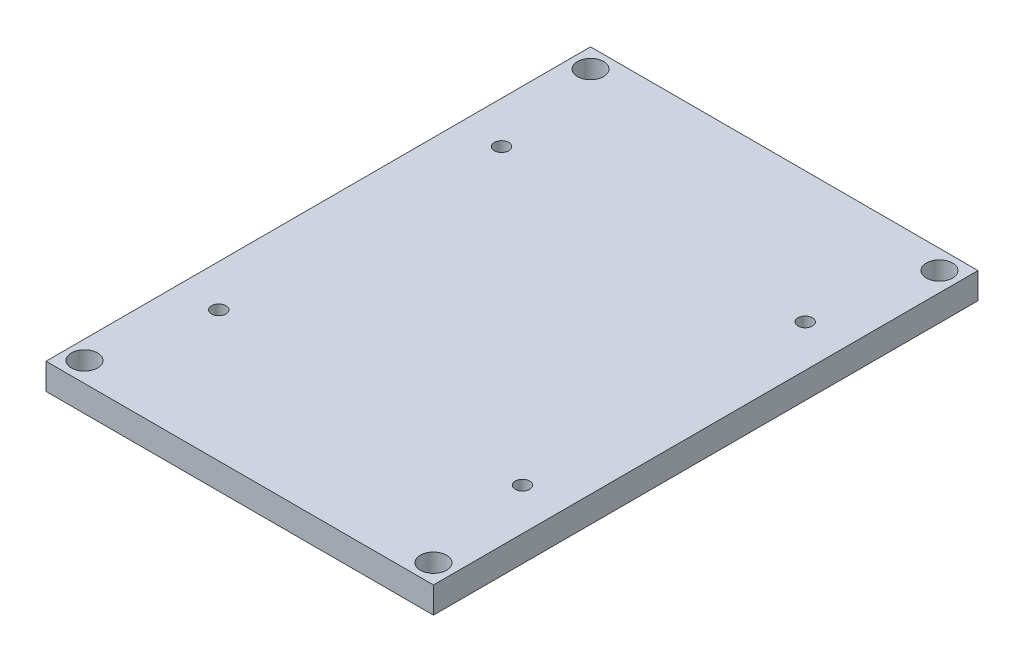
ISO-10303-21;
HEADER;
FILE_DESCRIPTION(('STEP AP214'),'2;1');
FILE_NAME('part.step','',(''),(''),'','','');
FILE_SCHEMA(('AUTOMOTIVE_DESIGN { 1 0 10303 214 1 1 1 1 }'));
ENDSEC;
DATA;
#1=APPLICATION_CONTEXT('core data for automotive mechanical design processes');
#2=APPLICATION_PROTOCOL_DEFINITION('international standard','automotive_design',2000,#1);
#3=PRODUCT_CONTEXT('',#1,'mechanical');
#4=PRODUCT('Part','Part','',(#3));
#5=PRODUCT_RELATED_PRODUCT_CATEGORY('part','',(#4));
#6=PRODUCT_DEFINITION_FORMATION('','',#4);
#7=PRODUCT_DEFINITION_CONTEXT('part definition',#1,'design');
#8=PRODUCT_DEFINITION('design','',#6,#7);
#9=PRODUCT_DEFINITION_SHAPE('','',#8);
#10=(LENGTH_UNIT() NAMED_UNIT(*) SI_UNIT(.MILLI.,.METRE.));
#11=(NAMED_UNIT(*) PLANE_ANGLE_UNIT() SI_UNIT($,.RADIAN.));
#12=(NAMED_UNIT(*) SI_UNIT($,.STERADIAN.) SOLID_ANGLE_UNIT());
#13=UNCERTAINTY_MEASURE_WITH_UNIT(LENGTH_MEASURE(1.E-05),#10,'distance_accuracy_value','');
#14=(GEOMETRIC_REPRESENTATION_CONTEXT(3) GLOBAL_UNCERTAINTY_ASSIGNED_CONTEXT((#13)) GLOBAL_UNIT_ASSIGNED_CONTEXT((#10,
#11,#12)) REPRESENTATION_CONTEXT('',''));
#15=CARTESIAN_POINT('',(0.,0.,0.));
#16=DIRECTION('',(0.,0.,1.));
#17=DIRECTION('',(1.,0.,0.));
#18=AXIS2_PLACEMENT_3D('',#15,#16,#17);
#19=CARTESIAN_POINT('',(-46.99,6.35,-66.04));
#20=DIRECTION('',(0.,0.,-1.));
#21=DIRECTION('',(-1.,0.,0.));
#22=AXIS2_PLACEMENT_3D('',#19,#20,#21);
#23=PLANE('',#22);
#24=DIRECTION('',(1.,0.,0.));
#25=VECTOR('',#24,1.);
#26=CARTESIAN_POINT('',(-46.99,0.,-66.04));
#27=LINE('',#26,#25);
#28=CARTESIAN_POINT('',(-46.99,0.,-66.04));
#29=VERTEX_POINT('',#28);
#30=CARTESIAN_POINT('',(46.99,0.,-66.04));
#31=VERTEX_POINT('',#30);
#32=EDGE_CURVE('E110',#29,#31,#27,.T.);
#33=ORIENTED_EDGE('',*,*,#32,.F.);
#34=DIRECTION('',(0.,-1.,0.));
#35=VECTOR('',#34,1.);
#36=CARTESIAN_POINT('',(-46.99,6.35,-66.04));
#37=LINE('',#36,#35);
#38=CARTESIAN_POINT('',(-46.99,6.35,-66.04));
#39=VERTEX_POINT('',#38);
#40=EDGE_CURVE('E11',#39,#29,#37,.T.);
#41=ORIENTED_EDGE('',*,*,#40,.F.);
#42=DIRECTION('',(1.,0.,0.));
#43=VECTOR('',#42,1.);
#44=CARTESIAN_POINT('',(-46.99,6.35,-66.04));
#45=LINE('',#44,#43);
#46=CARTESIAN_POINT('',(46.99,6.35,-66.04));
#47=VERTEX_POINT('',#46);
#48=EDGE_CURVE('E101',#39,#47,#45,.T.);
#49=ORIENTED_EDGE('',*,*,#48,.T.);
#50=DIRECTION('',(0.,-1.,0.));
#51=VECTOR('',#50,1.);
#52=CARTESIAN_POINT('',(46.99,6.35,-66.04));
#53=LINE('',#52,#51);
#54=EDGE_CURVE('E42',#47,#31,#53,.T.);
#55=ORIENTED_EDGE('',*,*,#54,.T.);
#56=EDGE_LOOP('',(#33,#41,#49,#55));
#57=FACE_BOUND('',#56,.T.);
#58=ADVANCED_FACE('F39',(#57),#23,.T.);
#59=CARTESIAN_POINT('',(-46.99,6.35,66.04));
#60=DIRECTION('',(-1.,0.,0.));
#61=DIRECTION('',(0.,0.,1.));
#62=AXIS2_PLACEMENT_3D('',#59,#60,#61);
#63=PLANE('',#62);
#64=DIRECTION('',(0.,0.,-1.));
#65=VECTOR('',#64,1.);
#66=CARTESIAN_POINT('',(-46.99,0.,66.04));
#67=LINE('',#66,#65);
#68=CARTESIAN_POINT('',(-46.99,0.,66.04));
#69=VERTEX_POINT('',#68);
#70=EDGE_CURVE('E104',#69,#29,#67,.T.);
#71=ORIENTED_EDGE('',*,*,#70,.F.);
#72=DIRECTION('',(0.,-1.,0.));
#73=VECTOR('',#72,1.);
#74=CARTESIAN_POINT('',(-46.99,6.35,66.04));
#75=LINE('',#74,#73);
#76=CARTESIAN_POINT('',(-46.99,6.35,66.04));
#77=VERTEX_POINT('',#76);
#78=EDGE_CURVE('E49',#77,#69,#75,.T.);
#79=ORIENTED_EDGE('',*,*,#78,.F.);
#80=DIRECTION('',(0.,0.,-1.));
#81=VECTOR('',#80,1.);
#82=CARTESIAN_POINT('',(-46.99,6.35,66.04));
#83=LINE('',#82,#81);
#84=EDGE_CURVE('E88',#77,#39,#83,.T.);
#85=ORIENTED_EDGE('',*,*,#84,.T.);
#86=ORIENTED_EDGE('',*,*,#40,.T.);
#87=EDGE_LOOP('',(#71,#79,#85,#86));
#88=FACE_BOUND('',#87,.T.);
#89=ADVANCED_FACE('F127',(#88),#63,.T.);
#90=CARTESIAN_POINT('',(-46.99,6.35,66.04));
#91=DIRECTION('',(0.,0.,-1.));
#92=DIRECTION('',(-1.,0.,0.));
#93=AXIS2_PLACEMENT_3D('',#90,#91,#92);
#94=PLANE('',#93);
#95=DIRECTION('',(1.,0.,0.));
#96=VECTOR('',#95,1.);
#97=CARTESIAN_POINT('',(-46.99,0.,66.04));
#98=LINE('',#97,#96);
#99=CARTESIAN_POINT('',(46.99,0.,66.04));
#100=VERTEX_POINT('',#99);
#101=EDGE_CURVE('E94',#69,#100,#98,.T.);
#102=ORIENTED_EDGE('',*,*,#101,.T.);
#103=DIRECTION('',(0.,-1.,0.));
#104=VECTOR('',#103,1.);
#105=CARTESIAN_POINT('',(46.99,6.35,66.04));
#106=LINE('',#105,#104);
#107=CARTESIAN_POINT('',(46.99,6.35,66.04));
#108=VERTEX_POINT('',#107);
#109=EDGE_CURVE('E92',#108,#100,#106,.T.);
#110=ORIENTED_EDGE('',*,*,#109,.F.);
#111=DIRECTION('',(1.,0.,0.));
#112=VECTOR('',#111,1.);
#113=CARTESIAN_POINT('',(-46.99,6.35,66.04));
#114=LINE('',#113,#112);
#115=EDGE_CURVE('E85',#77,#108,#114,.T.);
#116=ORIENTED_EDGE('',*,*,#115,.F.);
#117=ORIENTED_EDGE('',*,*,#78,.T.);
#118=EDGE_LOOP('',(#102,#110,#116,#117));
#119=FACE_BOUND('',#118,.T.);
#120=ADVANCED_FACE('F93',(#119),#94,.F.);
#121=CARTESIAN_POINT('',(46.99,6.35,66.04));
#122=DIRECTION('',(-1.,0.,0.));
#123=DIRECTION('',(0.,0.,1.));
#124=AXIS2_PLACEMENT_3D('',#121,#122,#123);
#125=PLANE('',#124);
#126=DIRECTION('',(0.,0.,-1.));
#127=VECTOR('',#126,1.);
#128=CARTESIAN_POINT('',(46.99,0.,66.04));
#129=LINE('',#128,#127);
#130=EDGE_CURVE('E114',#100,#31,#129,.T.);
#131=ORIENTED_EDGE('',*,*,#130,.T.);
#132=ORIENTED_EDGE('',*,*,#54,.F.);
#133=DIRECTION('',(0.,0.,-1.));
#134=VECTOR('',#133,1.);
#135=CARTESIAN_POINT('',(46.99,6.35,66.04));
#136=LINE('',#135,#134);
#137=EDGE_CURVE('E82',#108,#47,#136,.T.);
#138=ORIENTED_EDGE('',*,*,#137,.F.);
#139=ORIENTED_EDGE('',*,*,#109,.T.);
#140=EDGE_LOOP('',(#131,#132,#138,#139));
#141=FACE_BOUND('',#140,.T.);
#142=ADVANCED_FACE('F99',(#141),#125,.F.);
#143=CARTESIAN_POINT('',(0.,6.35,0.));
#144=DIRECTION('',(0.,1.,0.));
#145=DIRECTION('',(0.,0.,1.));
#146=AXIS2_PLACEMENT_3D('',#143,#144,#145);
#147=PLANE('',#146);
#148=CARTESIAN_POINT('',(36.83,6.35,-34.29));
#149=DIRECTION('',(0.,1.,0.));
#150=DIRECTION('',(0.,0.,1.));
#151=AXIS2_PLACEMENT_3D('',#148,#149,#150);
#152=CIRCLE('',#151,1.7526);
#153=CARTESIAN_POINT('',(36.83,6.35,-32.5374));
#154=VERTEX_POINT('',#153);
#155=EDGE_CURVE('E201',#154,#154,#152,.T.);
#156=ORIENTED_EDGE('',*,*,#155,.F.);
#157=EDGE_LOOP('',(#156));
#158=FACE_BOUND('',#157,.T.);
#159=CARTESIAN_POINT('',(-36.83,6.35,34.29));
#160=DIRECTION('',(0.,1.,0.));
#161=DIRECTION('',(0.,0.,1.));
#162=AXIS2_PLACEMENT_3D('',#159,#160,#161);
#163=CIRCLE('',#162,1.7526);
#164=CARTESIAN_POINT('',(-36.83,6.35,36.0426));
#165=VERTEX_POINT('',#164);
#166=EDGE_CURVE('E193',#165,#165,#163,.T.);
#167=ORIENTED_EDGE('',*,*,#166,.F.);
#168=EDGE_LOOP('',(#167));
#169=FACE_BOUND('',#168,.T.);
#170=CARTESIAN_POINT('',(36.83,6.35,34.29));
#171=DIRECTION('',(0.,1.,0.));
#172=DIRECTION('',(0.,0.,1.));
#173=AXIS2_PLACEMENT_3D('',#170,#171,#172);
#174=CIRCLE('',#173,1.7526);
#175=CARTESIAN_POINT('',(36.83,6.35,36.0426));
#176=VERTEX_POINT('',#175);
#177=EDGE_CURVE('E188',#176,#176,#174,.T.);
#178=ORIENTED_EDGE('',*,*,#177,.F.);
#179=EDGE_LOOP('',(#178));
#180=FACE_BOUND('',#179,.T.);
#181=CARTESIAN_POINT('',(-36.83,6.35,-34.29));
#182=DIRECTION('',(0.,1.,0.));
#183=DIRECTION('',(0.,0.,1.));
#184=AXIS2_PLACEMENT_3D('',#181,#182,#183);
#185=CIRCLE('',#184,1.7526);
#186=CARTESIAN_POINT('',(-36.83,6.35,-32.5374));
#187=VERTEX_POINT('',#186);
#188=EDGE_CURVE('E200',#187,#187,#185,.T.);
#189=ORIENTED_EDGE('',*,*,#188,.F.);
#190=EDGE_LOOP('',(#189));
#191=FACE_BOUND('',#190,.T.);
#192=CARTESIAN_POINT('',(42.320266817044,6.35,-61.370266817044));
#193=DIRECTION('',(0.,1.,0.));
#194=DIRECTION('',(0.,0.,1.));
#195=AXIS2_PLACEMENT_3D('',#192,#193,#194);
#196=CIRCLE('',#195,3.175);
#197=CARTESIAN_POINT('',(42.320266817044,6.35,-58.195266817044));
#198=VERTEX_POINT('',#197);
#199=EDGE_CURVE('E233',#198,#198,#196,.T.);
#200=ORIENTED_EDGE('',*,*,#199,.F.);
#201=EDGE_LOOP('',(#200));
#202=FACE_BOUND('',#201,.T.);
#203=CARTESIAN_POINT('',(-42.4893072344204,6.35,61.2071353598658));
#204=DIRECTION('',(0.,1.,0.));
#205=DIRECTION('',(0.,0.,1.));
#206=AXIS2_PLACEMENT_3D('',#203,#204,#205);
#207=CIRCLE('',#206,3.175);
#208=CARTESIAN_POINT('',(-42.4893072344204,6.35,64.3821353598658));
#209=VERTEX_POINT('',#208);
#210=EDGE_CURVE('E224',#209,#209,#207,.T.);
#211=ORIENTED_EDGE('',*,*,#210,.F.);
#212=EDGE_LOOP('',(#211));
#213=FACE_BOUND('',#212,.T.);
#214=CARTESIAN_POINT('',(42.320266817044,6.35,61.3702668170441));
#215=DIRECTION('',(0.,1.,0.));
#216=DIRECTION('',(0.,0.,1.));
#217=AXIS2_PLACEMENT_3D('',#214,#215,#216);
#218=CIRCLE('',#217,3.175);
#219=CARTESIAN_POINT('',(42.320266817044,6.35,64.5452668170441));
#220=VERTEX_POINT('',#219);
#221=EDGE_CURVE('E216',#220,#220,#218,.T.);
#222=ORIENTED_EDGE('',*,*,#221,.F.);
#223=EDGE_LOOP('',(#222));
#224=FACE_BOUND('',#223,.T.);
#225=CARTESIAN_POINT('',(-42.3202668170441,6.35,-61.370266817044));
#226=DIRECTION('',(0.,1.,0.));
#227=DIRECTION('',(0.,0.,1.));
#228=AXIS2_PLACEMENT_3D('',#225,#226,#227);
#229=CIRCLE('',#228,3.17499999999999);
#230=CARTESIAN_POINT('',(-42.3202668170441,6.35,-58.195266817044));
#231=VERTEX_POINT('',#230);
#232=EDGE_CURVE('E232',#231,#231,#229,.T.);
#233=ORIENTED_EDGE('',*,*,#232,.F.);
#234=EDGE_LOOP('',(#233));
#235=FACE_BOUND('',#234,.T.);
#236=ORIENTED_EDGE('',*,*,#48,.F.);
#237=ORIENTED_EDGE('',*,*,#84,.F.);
#238=ORIENTED_EDGE('',*,*,#115,.T.);
#239=ORIENTED_EDGE('',*,*,#137,.T.);
#240=EDGE_LOOP('',(#236,#237,#238,#239));
#241=FACE_BOUND('',#240,.T.);
#242=ADVANCED_FACE('F87',(#158,#169,#180,#191,#202,#213,#224,#235,#241),#147,.T.);
#243=CARTESIAN_POINT('',(0.,0.,0.));
#244=DIRECTION('',(0.,1.,0.));
#245=DIRECTION('',(0.,0.,1.));
#246=AXIS2_PLACEMENT_3D('',#243,#244,#245);
#247=PLANE('',#246);
#248=CARTESIAN_POINT('',(36.83,0.,-34.29));
#249=DIRECTION('',(0.,1.,0.));
#250=DIRECTION('',(0.,0.,1.));
#251=AXIS2_PLACEMENT_3D('',#248,#249,#250);
#252=CIRCLE('',#251,1.7526);
#253=CARTESIAN_POINT('',(36.83,0.,-32.5374));
#254=VERTEX_POINT('',#253);
#255=EDGE_CURVE('E196',#254,#254,#252,.T.);
#256=ORIENTED_EDGE('',*,*,#255,.T.);
#257=EDGE_LOOP('',(#256));
#258=FACE_BOUND('',#257,.T.);
#259=CARTESIAN_POINT('',(-36.83,0.,34.29));
#260=DIRECTION('',(0.,1.,0.));
#261=DIRECTION('',(0.,0.,1.));
#262=AXIS2_PLACEMENT_3D('',#259,#260,#261);
#263=CIRCLE('',#262,1.7526);
#264=CARTESIAN_POINT('',(-36.83,0.,36.0426));
#265=VERTEX_POINT('',#264);
#266=EDGE_CURVE('E205',#265,#265,#263,.T.);
#267=ORIENTED_EDGE('',*,*,#266,.T.);
#268=EDGE_LOOP('',(#267));
#269=FACE_BOUND('',#268,.T.);
#270=CARTESIAN_POINT('',(36.83,0.,34.29));
#271=DIRECTION('',(0.,1.,0.));
#272=DIRECTION('',(0.,0.,1.));
#273=AXIS2_PLACEMENT_3D('',#270,#271,#272);
#274=CIRCLE('',#273,1.7526);
#275=CARTESIAN_POINT('',(36.83,0.,36.0426));
#276=VERTEX_POINT('',#275);
#277=EDGE_CURVE('E185',#276,#276,#274,.T.);
#278=ORIENTED_EDGE('',*,*,#277,.T.);
#279=EDGE_LOOP('',(#278));
#280=FACE_BOUND('',#279,.T.);
#281=CARTESIAN_POINT('',(-36.83,0.,-34.29));
#282=DIRECTION('',(0.,1.,0.));
#283=DIRECTION('',(0.,0.,1.));
#284=AXIS2_PLACEMENT_3D('',#281,#282,#283);
#285=CIRCLE('',#284,1.7526);
#286=CARTESIAN_POINT('',(-36.83,0.,-32.5374));
#287=VERTEX_POINT('',#286);
#288=EDGE_CURVE('E212',#287,#287,#285,.T.);
#289=ORIENTED_EDGE('',*,*,#288,.T.);
#290=EDGE_LOOP('',(#289));
#291=FACE_BOUND('',#290,.T.);
#292=CARTESIAN_POINT('',(42.320266817044,0.,-61.370266817044));
#293=DIRECTION('',(0.,1.,0.));
#294=DIRECTION('',(0.,0.,1.));
#295=AXIS2_PLACEMENT_3D('',#292,#293,#294);
#296=CIRCLE('',#295,3.175);
#297=CARTESIAN_POINT('',(42.320266817044,0.,-58.195266817044));
#298=VERTEX_POINT('',#297);
#299=EDGE_CURVE('E228',#298,#298,#296,.T.);
#300=ORIENTED_EDGE('',*,*,#299,.T.);
#301=EDGE_LOOP('',(#300));
#302=FACE_BOUND('',#301,.T.);
#303=CARTESIAN_POINT('',(-42.4893072344204,0.,61.2071353598658));
#304=DIRECTION('',(0.,1.,0.));
#305=DIRECTION('',(0.,0.,1.));
#306=AXIS2_PLACEMENT_3D('',#303,#304,#305);
#307=CIRCLE('',#306,3.175);
#308=CARTESIAN_POINT('',(-42.4893072344204,0.,64.3821353598658));
#309=VERTEX_POINT('',#308);
#310=EDGE_CURVE('E237',#309,#309,#307,.T.);
#311=ORIENTED_EDGE('',*,*,#310,.T.);
#312=EDGE_LOOP('',(#311));
#313=FACE_BOUND('',#312,.T.);
#314=CARTESIAN_POINT('',(42.320266817044,0.,61.3702668170441));
#315=DIRECTION('',(0.,1.,0.));
#316=DIRECTION('',(0.,0.,1.));
#317=AXIS2_PLACEMENT_3D('',#314,#315,#316);
#318=CIRCLE('',#317,3.175);
#319=CARTESIAN_POINT('',(42.320266817044,0.,64.5452668170441));
#320=VERTEX_POINT('',#319);
#321=EDGE_CURVE('E220',#320,#320,#318,.T.);
#322=ORIENTED_EDGE('',*,*,#321,.T.);
#323=EDGE_LOOP('',(#322));
#324=FACE_BOUND('',#323,.T.);
#325=CARTESIAN_POINT('',(-42.3202668170441,0.,-61.370266817044));
#326=DIRECTION('',(0.,1.,0.));
#327=DIRECTION('',(0.,0.,1.));
#328=AXIS2_PLACEMENT_3D('',#325,#326,#327);
#329=CIRCLE('',#328,3.17499999999999);
#330=CARTESIAN_POINT('',(-42.3202668170441,0.,-58.195266817044));
#331=VERTEX_POINT('',#330);
#332=EDGE_CURVE('E115',#331,#331,#329,.T.);
#333=ORIENTED_EDGE('',*,*,#332,.T.);
#334=EDGE_LOOP('',(#333));
#335=FACE_BOUND('',#334,.T.);
#336=ORIENTED_EDGE('',*,*,#32,.T.);
#337=ORIENTED_EDGE('',*,*,#130,.F.);
#338=ORIENTED_EDGE('',*,*,#101,.F.);
#339=ORIENTED_EDGE('',*,*,#70,.T.);
#340=EDGE_LOOP('',(#336,#337,#338,#339));
#341=FACE_BOUND('',#340,.T.);
#342=ADVANCED_FACE('F126',(#258,#269,#280,#291,#302,#313,#324,#335,#341),#247,.F.);
#343=CARTESIAN_POINT('',(-42.3202668170441,0.,-61.370266817044));
#344=DIRECTION('',(0.,1.,0.));
#345=DIRECTION('',(0.,0.,1.));
#346=AXIS2_PLACEMENT_3D('',#343,#344,#345);
#347=CYLINDRICAL_SURFACE('',#346,3.17499999999999);
#348=ORIENTED_EDGE('',*,*,#332,.F.);
#349=EDGE_LOOP('',(#348));
#350=FACE_BOUND('',#349,.T.);
#351=ORIENTED_EDGE('',*,*,#232,.T.);
#352=EDGE_LOOP('',(#351));
#353=FACE_BOUND('',#352,.T.);
#354=ADVANCED_FACE('F145',(#350,#353),#347,.F.);
#355=CARTESIAN_POINT('',(42.320266817044,0.,61.3702668170441));
#356=DIRECTION('',(0.,1.,0.));
#357=DIRECTION('',(0.,0.,1.));
#358=AXIS2_PLACEMENT_3D('',#355,#356,#357);
#359=CYLINDRICAL_SURFACE('',#358,3.175);
#360=ORIENTED_EDGE('',*,*,#321,.F.);
#361=EDGE_LOOP('',(#360));
#362=FACE_BOUND('',#361,.T.);
#363=ORIENTED_EDGE('',*,*,#221,.T.);
#364=EDGE_LOOP('',(#363));
#365=FACE_BOUND('',#364,.T.);
#366=ADVANCED_FACE('F152',(#362,#365),#359,.F.);
#367=CARTESIAN_POINT('',(-42.4893072344204,0.,61.2071353598658));
#368=DIRECTION('',(0.,1.,0.));
#369=DIRECTION('',(0.,0.,1.));
#370=AXIS2_PLACEMENT_3D('',#367,#368,#369);
#371=CYLINDRICAL_SURFACE('',#370,3.175);
#372=ORIENTED_EDGE('',*,*,#310,.F.);
#373=EDGE_LOOP('',(#372));
#374=FACE_BOUND('',#373,.T.);
#375=ORIENTED_EDGE('',*,*,#210,.T.);
#376=EDGE_LOOP('',(#375));
#377=FACE_BOUND('',#376,.T.);
#378=ADVANCED_FACE('F154',(#374,#377),#371,.F.);
#379=CARTESIAN_POINT('',(42.320266817044,0.,-61.370266817044));
#380=DIRECTION('',(0.,1.,0.));
#381=DIRECTION('',(0.,0.,1.));
#382=AXIS2_PLACEMENT_3D('',#379,#380,#381);
#383=CYLINDRICAL_SURFACE('',#382,3.175);
#384=ORIENTED_EDGE('',*,*,#299,.F.);
#385=EDGE_LOOP('',(#384));
#386=FACE_BOUND('',#385,.T.);
#387=ORIENTED_EDGE('',*,*,#199,.T.);
#388=EDGE_LOOP('',(#387));
#389=FACE_BOUND('',#388,.T.);
#390=ADVANCED_FACE('F157',(#386,#389),#383,.F.);
#391=CARTESIAN_POINT('',(-36.83,0.,-34.29));
#392=DIRECTION('',(0.,1.,0.));
#393=DIRECTION('',(0.,0.,1.));
#394=AXIS2_PLACEMENT_3D('',#391,#392,#393);
#395=CYLINDRICAL_SURFACE('',#394,1.7526);
#396=ORIENTED_EDGE('',*,*,#288,.F.);
#397=EDGE_LOOP('',(#396));
#398=FACE_BOUND('',#397,.T.);
#399=ORIENTED_EDGE('',*,*,#188,.T.);
#400=EDGE_LOOP('',(#399));
#401=FACE_BOUND('',#400,.T.);
#402=ADVANCED_FACE('F161',(#398,#401),#395,.F.);
#403=CARTESIAN_POINT('',(36.83,0.,34.29));
#404=DIRECTION('',(0.,1.,0.));
#405=DIRECTION('',(0.,0.,1.));
#406=AXIS2_PLACEMENT_3D('',#403,#404,#405);
#407=CYLINDRICAL_SURFACE('',#406,1.7526);
#408=ORIENTED_EDGE('',*,*,#277,.F.);
#409=EDGE_LOOP('',(#408));
#410=FACE_BOUND('',#409,.T.);
#411=ORIENTED_EDGE('',*,*,#177,.T.);
#412=EDGE_LOOP('',(#411));
#413=FACE_BOUND('',#412,.T.);
#414=ADVANCED_FACE('F168',(#410,#413),#407,.F.);
#415=CARTESIAN_POINT('',(-36.83,0.,34.29));
#416=DIRECTION('',(0.,1.,0.));
#417=DIRECTION('',(0.,0.,1.));
#418=AXIS2_PLACEMENT_3D('',#415,#416,#417);
#419=CYLINDRICAL_SURFACE('',#418,1.7526);
#420=ORIENTED_EDGE('',*,*,#266,.F.);
#421=EDGE_LOOP('',(#420));
#422=FACE_BOUND('',#421,.T.);
#423=ORIENTED_EDGE('',*,*,#166,.T.);
#424=EDGE_LOOP('',(#423));
#425=FACE_BOUND('',#424,.T.);
#426=ADVANCED_FACE('F170',(#422,#425),#419,.F.);
#427=CARTESIAN_POINT('',(36.83,0.,-34.29));
#428=DIRECTION('',(0.,1.,0.));
#429=DIRECTION('',(0.,0.,1.));
#430=AXIS2_PLACEMENT_3D('',#427,#428,#429);
#431=CYLINDRICAL_SURFACE('',#430,1.7526);
#432=ORIENTED_EDGE('',*,*,#255,.F.);
#433=EDGE_LOOP('',(#432));
#434=FACE_BOUND('',#433,.T.);
#435=ORIENTED_EDGE('',*,*,#155,.T.);
#436=EDGE_LOOP('',(#435));
#437=FACE_BOUND('',#436,.T.);
#438=ADVANCED_FACE('F173',(#434,#437),#431,.F.);
#439=CLOSED_SHELL('',(#58,#89,#120,#142,#242,#342,#354,#366,#378,#390,#402,#414,#426,#438));
#440=MANIFOLD_SOLID_BREP('B2',#439);
#441=ADVANCED_BREP_SHAPE_REPRESENTATION('',(#18,#440),#14);
#442=SHAPE_DEFINITION_REPRESENTATION(#9,#441);
ENDSEC;
END-ISO-10303-21;
